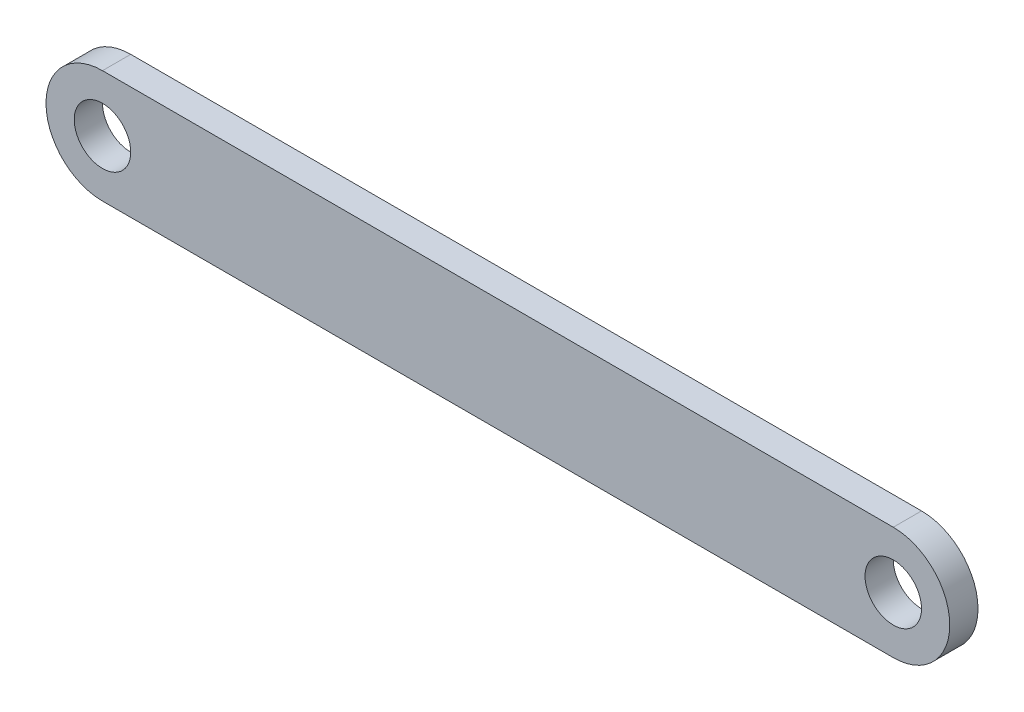
ISO-10303-21;
HEADER;
FILE_DESCRIPTION(('STEP AP214'),'2;1');
FILE_NAME('part.step','',(''),(''),'','','');
FILE_SCHEMA(('AUTOMOTIVE_DESIGN { 1 0 10303 214 1 1 1 1 }'));
ENDSEC;
DATA;
#1=APPLICATION_CONTEXT('core data for automotive mechanical design processes');
#2=APPLICATION_PROTOCOL_DEFINITION('international standard','automotive_design',2000,#1);
#3=PRODUCT_CONTEXT('',#1,'mechanical');
#4=PRODUCT('Part','Part','',(#3));
#5=PRODUCT_RELATED_PRODUCT_CATEGORY('part','',(#4));
#6=PRODUCT_DEFINITION_FORMATION('','',#4);
#7=PRODUCT_DEFINITION_CONTEXT('part definition',#1,'design');
#8=PRODUCT_DEFINITION('design','',#6,#7);
#9=PRODUCT_DEFINITION_SHAPE('','',#8);
#10=(LENGTH_UNIT() NAMED_UNIT(*) SI_UNIT(.MILLI.,.METRE.));
#11=(NAMED_UNIT(*) PLANE_ANGLE_UNIT() SI_UNIT($,.RADIAN.));
#12=(NAMED_UNIT(*) SI_UNIT($,.STERADIAN.) SOLID_ANGLE_UNIT());
#13=UNCERTAINTY_MEASURE_WITH_UNIT(LENGTH_MEASURE(1.E-05),#10,'distance_accuracy_value','');
#14=(GEOMETRIC_REPRESENTATION_CONTEXT(3) GLOBAL_UNCERTAINTY_ASSIGNED_CONTEXT((#13)) GLOBAL_UNIT_ASSIGNED_CONTEXT((#10,
#11,#12)) REPRESENTATION_CONTEXT('',''));
#15=CARTESIAN_POINT('',(0.,0.,0.));
#16=DIRECTION('',(0.,0.,1.));
#17=DIRECTION('',(1.,0.,0.));
#18=AXIS2_PLACEMENT_3D('',#15,#16,#17);
#19=CARTESIAN_POINT('',(-70.,0.,5.));
#20=DIRECTION('',(0.,0.,1.));
#21=DIRECTION('',(1.,0.,0.));
#22=AXIS2_PLACEMENT_3D('',#19,#20,#21);
#23=PLANE('',#22);
#24=CARTESIAN_POINT('',(70.,0.,5.));
#25=DIRECTION('',(0.,0.,1.));
#26=DIRECTION('',(1.,0.,0.));
#27=AXIS2_PLACEMENT_3D('',#24,#25,#26);
#28=CIRCLE('',#27,5.);
#29=CARTESIAN_POINT('',(75.,0.,5.));
#30=VERTEX_POINT('',#29);
#31=EDGE_CURVE('E109',#30,#30,#28,.T.);
#32=ORIENTED_EDGE('',*,*,#31,.F.);
#33=EDGE_LOOP('',(#32));
#34=FACE_BOUND('',#33,.T.);
#35=CARTESIAN_POINT('',(-70.,0.,5.));
#36=DIRECTION('',(0.,0.,1.));
#37=DIRECTION('',(1.,0.,0.));
#38=AXIS2_PLACEMENT_3D('',#35,#36,#37);
#39=CIRCLE('',#38,10.);
#40=CARTESIAN_POINT('',(-70.,10.,5.));
#41=VERTEX_POINT('',#40);
#42=CARTESIAN_POINT('',(-70.,-10.,5.));
#43=VERTEX_POINT('',#42);
#44=EDGE_CURVE('E92',#41,#43,#39,.T.);
#45=ORIENTED_EDGE('',*,*,#44,.T.);
#46=DIRECTION('',(1.,0.,0.));
#47=VECTOR('',#46,1.);
#48=CARTESIAN_POINT('',(-70.,-10.,5.));
#49=LINE('',#48,#47);
#50=CARTESIAN_POINT('',(70.,-9.99999999999997,5.));
#51=VERTEX_POINT('',#50);
#52=EDGE_CURVE('E89',#43,#51,#49,.T.);
#53=ORIENTED_EDGE('',*,*,#52,.T.);
#54=CARTESIAN_POINT('',(70.,0.,5.));
#55=DIRECTION('',(0.,0.,1.));
#56=DIRECTION('',(1.,0.,0.));
#57=AXIS2_PLACEMENT_3D('',#54,#55,#56);
#58=CIRCLE('',#57,10.);
#59=CARTESIAN_POINT('',(70.,10.,5.));
#60=VERTEX_POINT('',#59);
#61=EDGE_CURVE('E91',#51,#60,#58,.T.);
#62=ORIENTED_EDGE('',*,*,#61,.T.);
#63=DIRECTION('',(-1.,0.,0.));
#64=VECTOR('',#63,1.);
#65=CARTESIAN_POINT('',(-70.,10.,5.));
#66=LINE('',#65,#64);
#67=EDGE_CURVE('E58',#60,#41,#66,.T.);
#68=ORIENTED_EDGE('',*,*,#67,.T.);
#69=EDGE_LOOP('',(#45,#53,#62,#68));
#70=FACE_BOUND('',#69,.T.);
#71=CARTESIAN_POINT('',(-70.,0.,5.));
#72=DIRECTION('',(0.,0.,1.));
#73=DIRECTION('',(1.,0.,0.));
#74=AXIS2_PLACEMENT_3D('',#71,#72,#73);
#75=CIRCLE('',#74,5.);
#76=CARTESIAN_POINT('',(-65.,0.,5.));
#77=VERTEX_POINT('',#76);
#78=EDGE_CURVE('E123',#77,#77,#75,.T.);
#79=ORIENTED_EDGE('',*,*,#78,.F.);
#80=EDGE_LOOP('',(#79));
#81=FACE_BOUND('',#80,.T.);
#82=ADVANCED_FACE('F43',(#34,#70,#81),#23,.T.);
#83=CARTESIAN_POINT('',(-70.,0.,0.));
#84=DIRECTION('',(0.,0.,1.));
#85=DIRECTION('',(1.,0.,0.));
#86=AXIS2_PLACEMENT_3D('',#83,#84,#85);
#87=PLANE('',#86);
#88=CARTESIAN_POINT('',(-70.,0.,0.));
#89=DIRECTION('',(0.,0.,1.));
#90=DIRECTION('',(1.,0.,0.));
#91=AXIS2_PLACEMENT_3D('',#88,#89,#90);
#92=CIRCLE('',#91,10.);
#93=CARTESIAN_POINT('',(-70.,10.,0.));
#94=VERTEX_POINT('',#93);
#95=CARTESIAN_POINT('',(-70.,-10.,0.));
#96=VERTEX_POINT('',#95);
#97=EDGE_CURVE('E110',#94,#96,#92,.T.);
#98=ORIENTED_EDGE('',*,*,#97,.F.);
#99=DIRECTION('',(-1.,0.,0.));
#100=VECTOR('',#99,1.);
#101=CARTESIAN_POINT('',(-70.,10.,0.));
#102=LINE('',#101,#100);
#103=CARTESIAN_POINT('',(70.,10.,0.));
#104=VERTEX_POINT('',#103);
#105=EDGE_CURVE('E85',#104,#94,#102,.T.);
#106=ORIENTED_EDGE('',*,*,#105,.F.);
#107=CARTESIAN_POINT('',(70.,0.,0.));
#108=DIRECTION('',(0.,0.,1.));
#109=DIRECTION('',(1.,0.,0.));
#110=AXIS2_PLACEMENT_3D('',#107,#108,#109);
#111=CIRCLE('',#110,10.);
#112=CARTESIAN_POINT('',(70.,-9.99999999999997,0.));
#113=VERTEX_POINT('',#112);
#114=EDGE_CURVE('E80',#113,#104,#111,.T.);
#115=ORIENTED_EDGE('',*,*,#114,.F.);
#116=DIRECTION('',(1.,0.,0.));
#117=VECTOR('',#116,1.);
#118=CARTESIAN_POINT('',(-70.,-10.,0.));
#119=LINE('',#118,#117);
#120=EDGE_CURVE('E97',#96,#113,#119,.T.);
#121=ORIENTED_EDGE('',*,*,#120,.F.);
#122=EDGE_LOOP('',(#98,#106,#115,#121));
#123=FACE_BOUND('',#122,.T.);
#124=CARTESIAN_POINT('',(70.,0.,0.));
#125=DIRECTION('',(0.,0.,1.));
#126=DIRECTION('',(1.,0.,0.));
#127=AXIS2_PLACEMENT_3D('',#124,#125,#126);
#128=CIRCLE('',#127,5.);
#129=CARTESIAN_POINT('',(75.,0.,0.));
#130=VERTEX_POINT('',#129);
#131=EDGE_CURVE('E124',#130,#130,#128,.T.);
#132=ORIENTED_EDGE('',*,*,#131,.T.);
#133=EDGE_LOOP('',(#132));
#134=FACE_BOUND('',#133,.T.);
#135=CARTESIAN_POINT('',(-70.,0.,0.));
#136=DIRECTION('',(0.,0.,1.));
#137=DIRECTION('',(1.,0.,0.));
#138=AXIS2_PLACEMENT_3D('',#135,#136,#137);
#139=CIRCLE('',#138,5.);
#140=CARTESIAN_POINT('',(-65.,0.,0.));
#141=VERTEX_POINT('',#140);
#142=EDGE_CURVE('E126',#141,#141,#139,.T.);
#143=ORIENTED_EDGE('',*,*,#142,.T.);
#144=EDGE_LOOP('',(#143));
#145=FACE_BOUND('',#144,.T.);
#146=ADVANCED_FACE('F119',(#123,#134,#145),#87,.F.);
#147=CARTESIAN_POINT('',(-70.,0.,5.));
#148=DIRECTION('',(0.,0.,-1.));
#149=DIRECTION('',(-1.,0.,0.));
#150=AXIS2_PLACEMENT_3D('',#147,#148,#149);
#151=CYLINDRICAL_SURFACE('',#150,10.);
#152=ORIENTED_EDGE('',*,*,#97,.T.);
#153=DIRECTION('',(0.,0.,-1.));
#154=VECTOR('',#153,1.);
#155=CARTESIAN_POINT('',(-70.,-10.,5.));
#156=LINE('',#155,#154);
#157=EDGE_CURVE('E11',#43,#96,#156,.T.);
#158=ORIENTED_EDGE('',*,*,#157,.F.);
#159=ORIENTED_EDGE('',*,*,#44,.F.);
#160=DIRECTION('',(0.,0.,-1.));
#161=VECTOR('',#160,1.);
#162=CARTESIAN_POINT('',(-70.,10.,5.));
#163=LINE('',#162,#161);
#164=EDGE_CURVE('E103',#41,#94,#163,.T.);
#165=ORIENTED_EDGE('',*,*,#164,.T.);
#166=EDGE_LOOP('',(#152,#158,#159,#165));
#167=FACE_BOUND('',#166,.T.);
#168=ADVANCED_FACE('F44',(#167),#151,.T.);
#169=CARTESIAN_POINT('',(-70.,-10.,5.));
#170=DIRECTION('',(0.,1.,0.));
#171=DIRECTION('',(-1.,0.,0.));
#172=AXIS2_PLACEMENT_3D('',#169,#170,#171);
#173=PLANE('',#172);
#174=ORIENTED_EDGE('',*,*,#120,.T.);
#175=DIRECTION('',(0.,0.,-1.));
#176=VECTOR('',#175,1.);
#177=CARTESIAN_POINT('',(70.,-9.99999999999997,5.));
#178=LINE('',#177,#176);
#179=EDGE_CURVE('E55',#51,#113,#178,.T.);
#180=ORIENTED_EDGE('',*,*,#179,.F.);
#181=ORIENTED_EDGE('',*,*,#52,.F.);
#182=ORIENTED_EDGE('',*,*,#157,.T.);
#183=EDGE_LOOP('',(#174,#180,#181,#182));
#184=FACE_BOUND('',#183,.T.);
#185=ADVANCED_FACE('F98',(#184),#173,.F.);
#186=CARTESIAN_POINT('',(70.,0.,5.));
#187=DIRECTION('',(0.,0.,-1.));
#188=DIRECTION('',(-1.,0.,0.));
#189=AXIS2_PLACEMENT_3D('',#186,#187,#188);
#190=CYLINDRICAL_SURFACE('',#189,10.);
#191=ORIENTED_EDGE('',*,*,#114,.T.);
#192=DIRECTION('',(0.,0.,-1.));
#193=VECTOR('',#192,1.);
#194=CARTESIAN_POINT('',(70.,10.,5.));
#195=LINE('',#194,#193);
#196=EDGE_CURVE('E99',#60,#104,#195,.T.);
#197=ORIENTED_EDGE('',*,*,#196,.F.);
#198=ORIENTED_EDGE('',*,*,#61,.F.);
#199=ORIENTED_EDGE('',*,*,#179,.T.);
#200=EDGE_LOOP('',(#191,#197,#198,#199));
#201=FACE_BOUND('',#200,.T.);
#202=ADVANCED_FACE('F101',(#201),#190,.T.);
#203=CARTESIAN_POINT('',(-70.,10.,5.));
#204=DIRECTION('',(0.,-1.,0.));
#205=DIRECTION('',(1.,0.,0.));
#206=AXIS2_PLACEMENT_3D('',#203,#204,#205);
#207=PLANE('',#206);
#208=ORIENTED_EDGE('',*,*,#105,.T.);
#209=ORIENTED_EDGE('',*,*,#164,.F.);
#210=ORIENTED_EDGE('',*,*,#67,.F.);
#211=ORIENTED_EDGE('',*,*,#196,.T.);
#212=EDGE_LOOP('',(#208,#209,#210,#211));
#213=FACE_BOUND('',#212,.T.);
#214=ADVANCED_FACE('F113',(#213),#207,.F.);
#215=CARTESIAN_POINT('',(70.,0.,5.));
#216=DIRECTION('',(0.,0.,-1.));
#217=DIRECTION('',(-1.,0.,0.));
#218=AXIS2_PLACEMENT_3D('',#215,#216,#217);
#219=CYLINDRICAL_SURFACE('',#218,5.);
#220=ORIENTED_EDGE('',*,*,#31,.T.);
#221=EDGE_LOOP('',(#220));
#222=FACE_BOUND('',#221,.T.);
#223=ORIENTED_EDGE('',*,*,#131,.F.);
#224=EDGE_LOOP('',(#223));
#225=FACE_BOUND('',#224,.T.);
#226=ADVANCED_FACE('F144',(#222,#225),#219,.F.);
#227=CARTESIAN_POINT('',(-70.,0.,5.));
#228=DIRECTION('',(0.,0.,-1.));
#229=DIRECTION('',(-1.,0.,0.));
#230=AXIS2_PLACEMENT_3D('',#227,#228,#229);
#231=CYLINDRICAL_SURFACE('',#230,5.);
#232=ORIENTED_EDGE('',*,*,#78,.T.);
#233=EDGE_LOOP('',(#232));
#234=FACE_BOUND('',#233,.T.);
#235=ORIENTED_EDGE('',*,*,#142,.F.);
#236=EDGE_LOOP('',(#235));
#237=FACE_BOUND('',#236,.T.);
#238=ADVANCED_FACE('F131',(#234,#237),#231,.F.);
#239=CLOSED_SHELL('',(#82,#146,#168,#185,#202,#214,#226,#238));
#240=MANIFOLD_SOLID_BREP('B2',#239);
#241=ADVANCED_BREP_SHAPE_REPRESENTATION('',(#18,#240),#14);
#242=SHAPE_DEFINITION_REPRESENTATION(#9,#241);
ENDSEC;
END-ISO-10303-21;
